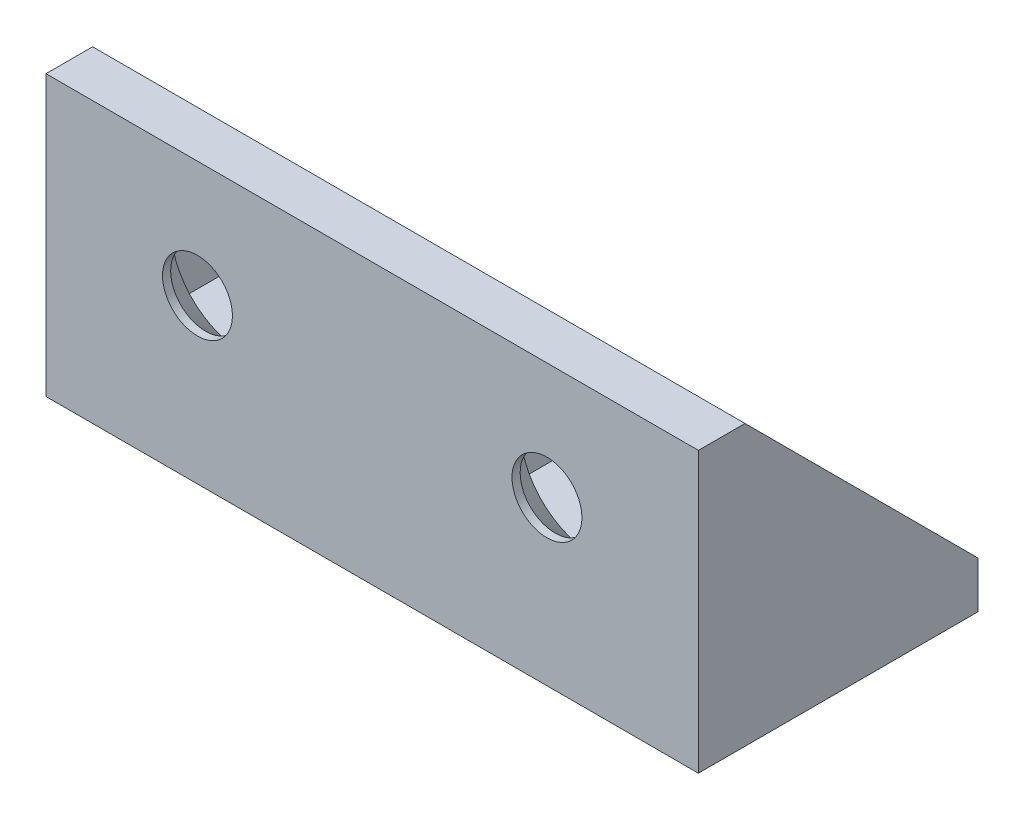
ISO-10303-21;
HEADER;
FILE_DESCRIPTION(('STEP AP214'),'2;1');
FILE_NAME('part.step','',(''),(''),'','','');
FILE_SCHEMA(('AUTOMOTIVE_DESIGN { 1 0 10303 214 1 1 1 1 }'));
ENDSEC;
DATA;
#1=APPLICATION_CONTEXT('core data for automotive mechanical design processes');
#2=APPLICATION_PROTOCOL_DEFINITION('international standard','automotive_design',2000,#1);
#3=PRODUCT_CONTEXT('',#1,'mechanical');
#4=PRODUCT('Part','Part','',(#3));
#5=PRODUCT_RELATED_PRODUCT_CATEGORY('part','',(#4));
#6=PRODUCT_DEFINITION_FORMATION('','',#4);
#7=PRODUCT_DEFINITION_CONTEXT('part definition',#1,'design');
#8=PRODUCT_DEFINITION('design','',#6,#7);
#9=PRODUCT_DEFINITION_SHAPE('','',#8);
#10=(LENGTH_UNIT() NAMED_UNIT(*) SI_UNIT(.MILLI.,.METRE.));
#11=(NAMED_UNIT(*) PLANE_ANGLE_UNIT() SI_UNIT($,.RADIAN.));
#12=(NAMED_UNIT(*) SI_UNIT($,.STERADIAN.) SOLID_ANGLE_UNIT());
#13=UNCERTAINTY_MEASURE_WITH_UNIT(LENGTH_MEASURE(1.E-05),#10,'distance_accuracy_value','');
#14=(GEOMETRIC_REPRESENTATION_CONTEXT(3) GLOBAL_UNCERTAINTY_ASSIGNED_CONTEXT((#13)) GLOBAL_UNIT_ASSIGNED_CONTEXT((#10,
#11,#12)) REPRESENTATION_CONTEXT('',''));
#15=CARTESIAN_POINT('',(0.,0.,0.));
#16=DIRECTION('',(0.,0.,1.));
#17=DIRECTION('',(1.,0.,0.));
#18=AXIS2_PLACEMENT_3D('',#15,#16,#17);
#19=CARTESIAN_POINT('',(9.99999999999999,14.,17.));
#20=DIRECTION('',(0.,0.,-1.));
#21=DIRECTION('',(-1.,0.,0.));
#22=AXIS2_PLACEMENT_3D('',#19,#20,#21);
#23=CYLINDRICAL_SURFACE('',#22,3.);
#24=CARTESIAN_POINT('',(9.99999999999999,14.,4.));
#25=DIRECTION('',(0.,0.,-1.));
#26=DIRECTION('',(-1.,0.,0.));
#27=AXIS2_PLACEMENT_3D('',#24,#25,#26);
#28=CIRCLE('',#27,3.);
#29=CARTESIAN_POINT('',(6.99999999999999,14.,4.));
#30=VERTEX_POINT('',#29);
#31=EDGE_CURVE('E200',#30,#30,#28,.T.);
#32=ORIENTED_EDGE('',*,*,#31,.F.);
#33=EDGE_LOOP('',(#32));
#34=FACE_BOUND('',#33,.T.);
#35=CARTESIAN_POINT('',(9.99999999999999,14.,3.3));
#36=DIRECTION('',(0.,0.,-1.));
#37=DIRECTION('',(-1.,0.,0.));
#38=AXIS2_PLACEMENT_3D('',#35,#36,#37);
#39=CIRCLE('',#38,3.);
#40=CARTESIAN_POINT('',(6.99999999999999,14.,3.3));
#41=VERTEX_POINT('',#40);
#42=EDGE_CURVE('E242',#41,#41,#39,.T.);
#43=ORIENTED_EDGE('',*,*,#42,.T.);
#44=EDGE_LOOP('',(#43));
#45=FACE_BOUND('',#44,.T.);
#46=ADVANCED_FACE('F37',(#34,#45),#23,.F.);
#47=CARTESIAN_POINT('',(40.,14.,17.));
#48=DIRECTION('',(0.,0.,-1.));
#49=DIRECTION('',(-1.,0.,0.));
#50=AXIS2_PLACEMENT_3D('',#47,#48,#49);
#51=CYLINDRICAL_SURFACE('',#50,3.);
#52=CARTESIAN_POINT('',(40.,14.,4.));
#53=DIRECTION('',(0.,0.,-1.));
#54=DIRECTION('',(-1.,0.,0.));
#55=AXIS2_PLACEMENT_3D('',#52,#53,#54);
#56=CIRCLE('',#55,3.);
#57=CARTESIAN_POINT('',(37.,14.,4.));
#58=VERTEX_POINT('',#57);
#59=EDGE_CURVE('E215',#58,#58,#56,.T.);
#60=ORIENTED_EDGE('',*,*,#59,.F.);
#61=EDGE_LOOP('',(#60));
#62=FACE_BOUND('',#61,.T.);
#63=CARTESIAN_POINT('',(40.,14.,3.30000000000001));
#64=DIRECTION('',(0.,0.,-1.));
#65=DIRECTION('',(-1.,0.,0.));
#66=AXIS2_PLACEMENT_3D('',#63,#64,#65);
#67=CIRCLE('',#66,3.);
#68=CARTESIAN_POINT('',(37.,14.,3.30000000000001));
#69=VERTEX_POINT('',#68);
#70=EDGE_CURVE('E236',#69,#69,#67,.T.);
#71=ORIENTED_EDGE('',*,*,#70,.T.);
#72=EDGE_LOOP('',(#71));
#73=FACE_BOUND('',#72,.T.);
#74=ADVANCED_FACE('F309',(#62,#73),#51,.F.);
#75=CARTESIAN_POINT('',(10.,-16.,-10.));
#76=DIRECTION('',(0.,1.,0.));
#77=DIRECTION('',(-1.,0.,0.));
#78=AXIS2_PLACEMENT_3D('',#75,#76,#77);
#79=CYLINDRICAL_SURFACE('',#78,2.5);
#80=CARTESIAN_POINT('',(10.,0.,-10.));
#81=DIRECTION('',(0.,1.,0.));
#82=DIRECTION('',(0.,0.,1.));
#83=AXIS2_PLACEMENT_3D('',#80,#81,#82);
#84=CIRCLE('',#83,2.5);
#85=CARTESIAN_POINT('',(10.,0.,-7.5));
#86=VERTEX_POINT('',#85);
#87=EDGE_CURVE('E218',#86,#86,#84,.T.);
#88=ORIENTED_EDGE('',*,*,#87,.F.);
#89=EDGE_LOOP('',(#88));
#90=FACE_BOUND('',#89,.T.);
#91=CARTESIAN_POINT('',(10.,0.699999999999994,-10.));
#92=DIRECTION('',(0.,1.,0.));
#93=DIRECTION('',(0.,0.,1.));
#94=AXIS2_PLACEMENT_3D('',#91,#92,#93);
#95=CIRCLE('',#94,2.5);
#96=CARTESIAN_POINT('',(10.,0.699999999999994,-7.5));
#97=VERTEX_POINT('',#96);
#98=EDGE_CURVE('E230',#97,#97,#95,.T.);
#99=ORIENTED_EDGE('',*,*,#98,.T.);
#100=EDGE_LOOP('',(#99));
#101=FACE_BOUND('',#100,.T.);
#102=ADVANCED_FACE('F315',(#90,#101),#79,.F.);
#103=CARTESIAN_POINT('',(53.,4.,-20.));
#104=DIRECTION('',(0.,0.707106781186548,-0.707106781186548));
#105=DIRECTION('',(0.,0.707106781186548,0.707106781186548));
#106=AXIS2_PLACEMENT_3D('',#103,#104,#105);
#107=PLANE('',#106);
#108=DIRECTION('',(0.,0.707106781186548,0.707106781186548));
#109=VECTOR('',#108,1.);
#110=CARTESIAN_POINT('',(27.5,4.,-20.));
#111=LINE('',#110,#109);
#112=CARTESIAN_POINT('',(27.5,4.,-20.));
#113=VERTEX_POINT('',#112);
#114=CARTESIAN_POINT('',(27.5,24.,0.));
#115=VERTEX_POINT('',#114);
#116=EDGE_CURVE('E11',#113,#115,#111,.T.);
#117=ORIENTED_EDGE('',*,*,#116,.F.);
#118=DIRECTION('',(-1.,0.,0.));
#119=VECTOR('',#118,1.);
#120=CARTESIAN_POINT('',(0.,4.,-20.));
#121=LINE('',#120,#119);
#122=CARTESIAN_POINT('',(22.5,4.,-20.));
#123=VERTEX_POINT('',#122);
#124=EDGE_CURVE('E279',#113,#123,#121,.T.);
#125=ORIENTED_EDGE('',*,*,#124,.T.);
#126=DIRECTION('',(0.,-0.707106781186548,-0.707106781186548));
#127=VECTOR('',#126,1.);
#128=CARTESIAN_POINT('',(22.5,4.,-20.));
#129=LINE('',#128,#127);
#130=CARTESIAN_POINT('',(22.5,24.,0.));
#131=VERTEX_POINT('',#130);
#132=EDGE_CURVE('E144',#131,#123,#129,.T.);
#133=ORIENTED_EDGE('',*,*,#132,.F.);
#134=DIRECTION('',(-1.,0.,0.));
#135=VECTOR('',#134,1.);
#136=CARTESIAN_POINT('',(0.,24.,0.));
#137=LINE('',#136,#135);
#138=EDGE_CURVE('E150',#115,#131,#137,.T.);
#139=ORIENTED_EDGE('',*,*,#138,.F.);
#140=EDGE_LOOP('',(#117,#125,#133,#139));
#141=FACE_BOUND('',#140,.T.);
#142=ADVANCED_FACE('F277',(#141),#107,.T.);
#143=DIRECTION('',(0.,-0.707106781186548,-0.707106781186548));
#144=VECTOR('',#143,1.);
#145=CARTESIAN_POINT('',(50.5,4.,-20.));
#146=LINE('',#145,#144);
#147=CARTESIAN_POINT('',(50.5,24.,0.));
#148=VERTEX_POINT('',#147);
#149=CARTESIAN_POINT('',(50.5,4.,-20.));
#150=VERTEX_POINT('',#149);
#151=EDGE_CURVE('E45',#148,#150,#146,.T.);
#152=ORIENTED_EDGE('',*,*,#151,.F.);
#153=CARTESIAN_POINT('',(53.,24.,0.));
#154=VERTEX_POINT('',#153);
#155=EDGE_CURVE('E141',#154,#148,#137,.T.);
#156=ORIENTED_EDGE('',*,*,#155,.F.);
#157=DIRECTION('',(0.,-0.707106781186548,-0.707106781186548));
#158=VECTOR('',#157,1.);
#159=CARTESIAN_POINT('',(53.,4.,-20.));
#160=LINE('',#159,#158);
#161=CARTESIAN_POINT('',(53.,4.,-20.));
#162=VERTEX_POINT('',#161);
#163=EDGE_CURVE('E173',#154,#162,#160,.T.);
#164=ORIENTED_EDGE('',*,*,#163,.T.);
#165=EDGE_CURVE('E143',#162,#150,#121,.T.);
#166=ORIENTED_EDGE('',*,*,#165,.T.);
#167=EDGE_LOOP('',(#152,#156,#164,#166));
#168=FACE_BOUND('',#167,.T.);
#169=ADVANCED_FACE('F139',(#168),#107,.T.);
#170=DIRECTION('',(0.,0.707106781186548,0.707106781186548));
#171=VECTOR('',#170,1.);
#172=CARTESIAN_POINT('',(-0.5,4.,-20.));
#173=LINE('',#172,#171);
#174=CARTESIAN_POINT('',(-0.5,4.,-20.));
#175=VERTEX_POINT('',#174);
#176=CARTESIAN_POINT('',(-0.5,24.,0.));
#177=VERTEX_POINT('',#176);
#178=EDGE_CURVE('E264',#175,#177,#173,.T.);
#179=ORIENTED_EDGE('',*,*,#178,.F.);
#180=CARTESIAN_POINT('',(-3.,4.,-20.));
#181=VERTEX_POINT('',#180);
#182=EDGE_CURVE('E282',#175,#181,#121,.T.);
#183=ORIENTED_EDGE('',*,*,#182,.T.);
#184=DIRECTION('',(0.,-0.707106781186548,-0.707106781186548));
#185=VECTOR('',#184,1.);
#186=CARTESIAN_POINT('',(-3.,4.,-20.));
#187=LINE('',#186,#185);
#188=CARTESIAN_POINT('',(-3.,24.,0.));
#189=VERTEX_POINT('',#188);
#190=EDGE_CURVE('E186',#189,#181,#187,.T.);
#191=ORIENTED_EDGE('',*,*,#190,.F.);
#192=EDGE_CURVE('E152',#177,#189,#137,.T.);
#193=ORIENTED_EDGE('',*,*,#192,.F.);
#194=EDGE_LOOP('',(#179,#183,#191,#193));
#195=FACE_BOUND('',#194,.T.);
#196=ADVANCED_FACE('F269',(#195),#107,.T.);
#197=CARTESIAN_POINT('',(53.,0.,0.));
#198=DIRECTION('',(1.,0.,0.));
#199=DIRECTION('',(0.,0.,-1.));
#200=AXIS2_PLACEMENT_3D('',#197,#198,#199);
#201=PLANE('',#200);
#202=ORIENTED_EDGE('',*,*,#163,.F.);
#203=DIRECTION('',(0.,0.,-1.));
#204=VECTOR('',#203,1.);
#205=CARTESIAN_POINT('',(53.,24.,0.));
#206=LINE('',#205,#204);
#207=CARTESIAN_POINT('',(53.,24.,4.));
#208=VERTEX_POINT('',#207);
#209=EDGE_CURVE('E148',#208,#154,#206,.T.);
#210=ORIENTED_EDGE('',*,*,#209,.F.);
#211=DIRECTION('',(0.,1.,0.));
#212=VECTOR('',#211,1.);
#213=CARTESIAN_POINT('',(53.,24.,4.));
#214=LINE('',#213,#212);
#215=CARTESIAN_POINT('',(53.,0.,4.));
#216=VERTEX_POINT('',#215);
#217=EDGE_CURVE('E163',#216,#208,#214,.T.);
#218=ORIENTED_EDGE('',*,*,#217,.F.);
#219=DIRECTION('',(0.,0.,1.));
#220=VECTOR('',#219,1.);
#221=CARTESIAN_POINT('',(53.,0.,-20.));
#222=LINE('',#221,#220);
#223=CARTESIAN_POINT('',(53.,0.,-20.));
#224=VERTEX_POINT('',#223);
#225=EDGE_CURVE('E167',#224,#216,#222,.T.);
#226=ORIENTED_EDGE('',*,*,#225,.F.);
#227=DIRECTION('',(0.,-1.,0.));
#228=VECTOR('',#227,1.);
#229=CARTESIAN_POINT('',(53.,4.,-20.));
#230=LINE('',#229,#228);
#231=EDGE_CURVE('E170',#162,#224,#230,.T.);
#232=ORIENTED_EDGE('',*,*,#231,.F.);
#233=EDGE_LOOP('',(#202,#210,#218,#226,#232));
#234=FACE_BOUND('',#233,.T.);
#235=ADVANCED_FACE('F294',(#234),#201,.T.);
#236=CARTESIAN_POINT('',(-3.,0.,0.));
#237=DIRECTION('',(1.,0.,0.));
#238=DIRECTION('',(0.,0.,-1.));
#239=AXIS2_PLACEMENT_3D('',#236,#237,#238);
#240=PLANE('',#239);
#241=ORIENTED_EDGE('',*,*,#190,.T.);
#242=DIRECTION('',(0.,-1.,0.));
#243=VECTOR('',#242,1.);
#244=CARTESIAN_POINT('',(-3.,4.,-20.));
#245=LINE('',#244,#243);
#246=CARTESIAN_POINT('',(-3.,0.,-20.));
#247=VERTEX_POINT('',#246);
#248=EDGE_CURVE('E183',#181,#247,#245,.T.);
#249=ORIENTED_EDGE('',*,*,#248,.T.);
#250=DIRECTION('',(0.,0.,1.));
#251=VECTOR('',#250,1.);
#252=CARTESIAN_POINT('',(-3.,0.,-20.));
#253=LINE('',#252,#251);
#254=CARTESIAN_POINT('',(-3.,0.,4.));
#255=VERTEX_POINT('',#254);
#256=EDGE_CURVE('E180',#247,#255,#253,.T.);
#257=ORIENTED_EDGE('',*,*,#256,.T.);
#258=DIRECTION('',(0.,1.,0.));
#259=VECTOR('',#258,1.);
#260=CARTESIAN_POINT('',(-3.,24.,4.));
#261=LINE('',#260,#259);
#262=CARTESIAN_POINT('',(-3.,24.,4.));
#263=VERTEX_POINT('',#262);
#264=EDGE_CURVE('E177',#255,#263,#261,.T.);
#265=ORIENTED_EDGE('',*,*,#264,.T.);
#266=DIRECTION('',(0.,0.,-1.));
#267=VECTOR('',#266,1.);
#268=CARTESIAN_POINT('',(-3.,24.,0.));
#269=LINE('',#268,#267);
#270=EDGE_CURVE('E175',#263,#189,#269,.T.);
#271=ORIENTED_EDGE('',*,*,#270,.T.);
#272=EDGE_LOOP('',(#241,#249,#257,#265,#271));
#273=FACE_BOUND('',#272,.T.);
#274=ADVANCED_FACE('F288',(#273),#240,.F.);
#275=CARTESIAN_POINT('',(0.,0.,0.));
#276=DIRECTION('',(0.,1.,0.));
#277=DIRECTION('',(0.,0.,1.));
#278=AXIS2_PLACEMENT_3D('',#275,#276,#277);
#279=PLANE('',#278);
#280=ORIENTED_EDGE('',*,*,#87,.T.);
#281=EDGE_LOOP('',(#280));
#282=FACE_BOUND('',#281,.T.);
#283=CARTESIAN_POINT('',(40.,0.,-10.));
#284=DIRECTION('',(0.,1.,0.));
#285=DIRECTION('',(0.,0.,1.));
#286=AXIS2_PLACEMENT_3D('',#283,#284,#285);
#287=CIRCLE('',#286,2.5);
#288=CARTESIAN_POINT('',(40.,0.,-7.5));
#289=VERTEX_POINT('',#288);
#290=EDGE_CURVE('E221',#289,#289,#287,.T.);
#291=ORIENTED_EDGE('',*,*,#290,.T.);
#292=EDGE_LOOP('',(#291));
#293=FACE_BOUND('',#292,.T.);
#294=DIRECTION('',(1.,0.,0.));
#295=VECTOR('',#294,1.);
#296=CARTESIAN_POINT('',(0.,0.,4.));
#297=LINE('',#296,#295);
#298=EDGE_CURVE('E149',#255,#216,#297,.T.);
#299=ORIENTED_EDGE('',*,*,#298,.F.);
#300=ORIENTED_EDGE('',*,*,#256,.F.);
#301=DIRECTION('',(-1.,0.,0.));
#302=VECTOR('',#301,1.);
#303=CARTESIAN_POINT('',(0.,0.,-20.));
#304=LINE('',#303,#302);
#305=EDGE_CURVE('E153',#224,#247,#304,.T.);
#306=ORIENTED_EDGE('',*,*,#305,.F.);
#307=ORIENTED_EDGE('',*,*,#225,.T.);
#308=EDGE_LOOP('',(#299,#300,#306,#307));
#309=FACE_BOUND('',#308,.T.);
#310=ADVANCED_FACE('F362',(#282,#293,#309),#279,.F.);
#311=CARTESIAN_POINT('',(0.,4.,4.));
#312=DIRECTION('',(0.,0.,-1.));
#313=DIRECTION('',(-1.,0.,0.));
#314=AXIS2_PLACEMENT_3D('',#311,#312,#313);
#315=PLANE('',#314);
#316=ORIENTED_EDGE('',*,*,#59,.T.);
#317=EDGE_LOOP('',(#316));
#318=FACE_BOUND('',#317,.T.);
#319=ORIENTED_EDGE('',*,*,#31,.T.);
#320=EDGE_LOOP('',(#319));
#321=FACE_BOUND('',#320,.T.);
#322=ORIENTED_EDGE('',*,*,#298,.T.);
#323=ORIENTED_EDGE('',*,*,#217,.T.);
#324=DIRECTION('',(1.,0.,0.));
#325=VECTOR('',#324,1.);
#326=CARTESIAN_POINT('',(0.,24.,4.));
#327=LINE('',#326,#325);
#328=EDGE_CURVE('E157',#263,#208,#327,.T.);
#329=ORIENTED_EDGE('',*,*,#328,.F.);
#330=ORIENTED_EDGE('',*,*,#264,.F.);
#331=EDGE_LOOP('',(#322,#323,#329,#330));
#332=FACE_BOUND('',#331,.T.);
#333=ADVANCED_FACE('F39',(#318,#321,#332),#315,.F.);
#334=CARTESIAN_POINT('',(0.,4.,-20.));
#335=DIRECTION('',(0.,0.,1.));
#336=DIRECTION('',(1.,0.,0.));
#337=AXIS2_PLACEMENT_3D('',#334,#335,#336);
#338=PLANE('',#337);
#339=ORIENTED_EDGE('',*,*,#305,.T.);
#340=ORIENTED_EDGE('',*,*,#248,.F.);
#341=ORIENTED_EDGE('',*,*,#182,.F.);
#342=DIRECTION('',(-1.,0.,0.));
#343=VECTOR('',#342,1.);
#344=CARTESIAN_POINT('',(22.5,4.,-20.));
#345=LINE('',#344,#343);
#346=EDGE_CURVE('E196',#123,#175,#345,.T.);
#347=ORIENTED_EDGE('',*,*,#346,.F.);
#348=ORIENTED_EDGE('',*,*,#124,.F.);
#349=DIRECTION('',(-1.,0.,0.));
#350=VECTOR('',#349,1.);
#351=CARTESIAN_POINT('',(50.5,4.,-20.));
#352=LINE('',#351,#350);
#353=EDGE_CURVE('E135',#150,#113,#352,.T.);
#354=ORIENTED_EDGE('',*,*,#353,.F.);
#355=ORIENTED_EDGE('',*,*,#165,.F.);
#356=ORIENTED_EDGE('',*,*,#231,.T.);
#357=EDGE_LOOP('',(#339,#340,#341,#347,#348,#354,#355,#356));
#358=FACE_BOUND('',#357,.T.);
#359=ADVANCED_FACE('F285',(#358),#338,.F.);
#360=CARTESIAN_POINT('',(0.,24.,0.));
#361=DIRECTION('',(0.,-1.,0.));
#362=DIRECTION('',(0.,0.,-1.));
#363=AXIS2_PLACEMENT_3D('',#360,#361,#362);
#364=PLANE('',#363);
#365=ORIENTED_EDGE('',*,*,#155,.T.);
#366=DIRECTION('',(1.,0.,0.));
#367=VECTOR('',#366,1.);
#368=CARTESIAN_POINT('',(50.5,24.,0.));
#369=LINE('',#368,#367);
#370=EDGE_CURVE('E128',#115,#148,#369,.T.);
#371=ORIENTED_EDGE('',*,*,#370,.F.);
#372=ORIENTED_EDGE('',*,*,#138,.T.);
#373=DIRECTION('',(1.,0.,0.));
#374=VECTOR('',#373,1.);
#375=CARTESIAN_POINT('',(22.5,24.,0.));
#376=LINE('',#375,#374);
#377=EDGE_CURVE('E203',#177,#131,#376,.T.);
#378=ORIENTED_EDGE('',*,*,#377,.F.);
#379=ORIENTED_EDGE('',*,*,#192,.T.);
#380=ORIENTED_EDGE('',*,*,#270,.F.);
#381=ORIENTED_EDGE('',*,*,#328,.T.);
#382=ORIENTED_EDGE('',*,*,#209,.T.);
#383=EDGE_LOOP('',(#365,#371,#372,#378,#379,#380,#381,#382));
#384=FACE_BOUND('',#383,.T.);
#385=ADVANCED_FACE('F146',(#384),#364,.F.);
#386=CARTESIAN_POINT('',(22.5,4.,0.));
#387=DIRECTION('',(0.,-1.,0.));
#388=DIRECTION('',(1.,0.,0.));
#389=AXIS2_PLACEMENT_3D('',#386,#387,#388);
#390=PLANE('',#389);
#391=CARTESIAN_POINT('',(10.,4.,-10.));
#392=DIRECTION('',(0.,1.,0.));
#393=DIRECTION('',(0.,0.,1.));
#394=AXIS2_PLACEMENT_3D('',#391,#392,#393);
#395=CIRCLE('',#394,5.79999999999997);
#396=CARTESIAN_POINT('',(10.,4.,-4.20000000000004));
#397=VERTEX_POINT('',#396);
#398=EDGE_CURVE('E233',#397,#397,#395,.T.);
#399=ORIENTED_EDGE('',*,*,#398,.F.);
#400=EDGE_LOOP('',(#399));
#401=FACE_BOUND('',#400,.T.);
#402=ORIENTED_EDGE('',*,*,#346,.T.);
#403=DIRECTION('',(0.,0.,-1.));
#404=VECTOR('',#403,1.);
#405=CARTESIAN_POINT('',(-0.5,4.,0.));
#406=LINE('',#405,#404);
#407=CARTESIAN_POINT('',(-0.5,4.,0.));
#408=VERTEX_POINT('',#407);
#409=EDGE_CURVE('E190',#408,#175,#406,.T.);
#410=ORIENTED_EDGE('',*,*,#409,.F.);
#411=DIRECTION('',(-1.,0.,0.));
#412=VECTOR('',#411,1.);
#413=CARTESIAN_POINT('',(22.5,4.,0.));
#414=LINE('',#413,#412);
#415=CARTESIAN_POINT('',(22.5,4.,0.));
#416=VERTEX_POINT('',#415);
#417=EDGE_CURVE('E199',#416,#408,#414,.T.);
#418=ORIENTED_EDGE('',*,*,#417,.F.);
#419=DIRECTION('',(0.,0.,-1.));
#420=VECTOR('',#419,1.);
#421=CARTESIAN_POINT('',(22.5,4.,0.));
#422=LINE('',#421,#420);
#423=EDGE_CURVE('E192',#416,#123,#422,.T.);
#424=ORIENTED_EDGE('',*,*,#423,.T.);
#425=EDGE_LOOP('',(#402,#410,#418,#424));
#426=FACE_BOUND('',#425,.T.);
#427=ADVANCED_FACE('F260',(#401,#426),#390,.F.);
#428=CARTESIAN_POINT('',(22.5,24.,0.));
#429=DIRECTION('',(1.,0.,0.));
#430=DIRECTION('',(0.,0.,-1.));
#431=AXIS2_PLACEMENT_3D('',#428,#429,#430);
#432=PLANE('',#431);
#433=ORIENTED_EDGE('',*,*,#132,.T.);
#434=ORIENTED_EDGE('',*,*,#423,.F.);
#435=DIRECTION('',(0.,-1.,0.));
#436=VECTOR('',#435,1.);
#437=CARTESIAN_POINT('',(22.5,24.,0.));
#438=LINE('',#437,#436);
#439=EDGE_CURVE('E193',#131,#416,#438,.T.);
#440=ORIENTED_EDGE('',*,*,#439,.F.);
#441=EDGE_LOOP('',(#433,#434,#440));
#442=FACE_BOUND('',#441,.T.);
#443=ADVANCED_FACE('F273',(#442),#432,.F.);
#444=CARTESIAN_POINT('',(-0.5,4.,0.));
#445=DIRECTION('',(-1.,0.,0.));
#446=DIRECTION('',(0.,0.,1.));
#447=AXIS2_PLACEMENT_3D('',#444,#445,#446);
#448=PLANE('',#447);
#449=ORIENTED_EDGE('',*,*,#178,.T.);
#450=DIRECTION('',(0.,1.,0.));
#451=VECTOR('',#450,1.);
#452=CARTESIAN_POINT('',(-0.5,4.,0.));
#453=LINE('',#452,#451);
#454=EDGE_CURVE('E52',#408,#177,#453,.T.);
#455=ORIENTED_EDGE('',*,*,#454,.F.);
#456=ORIENTED_EDGE('',*,*,#409,.T.);
#457=EDGE_LOOP('',(#449,#455,#456));
#458=FACE_BOUND('',#457,.T.);
#459=ADVANCED_FACE('F255',(#458),#448,.F.);
#460=CARTESIAN_POINT('',(0.,0.,0.));
#461=DIRECTION('',(0.,0.,-1.));
#462=DIRECTION('',(-1.,0.,0.));
#463=AXIS2_PLACEMENT_3D('',#460,#461,#462);
#464=PLANE('',#463);
#465=CARTESIAN_POINT('',(9.99999999999999,14.,0.));
#466=DIRECTION('',(0.,0.,-1.));
#467=DIRECTION('',(-1.,0.,0.));
#468=AXIS2_PLACEMENT_3D('',#465,#466,#467);
#469=CIRCLE('',#468,6.29999999999997);
#470=CARTESIAN_POINT('',(3.70000000000003,14.,0.));
#471=VERTEX_POINT('',#470);
#472=EDGE_CURVE('E245',#471,#471,#469,.T.);
#473=ORIENTED_EDGE('',*,*,#472,.F.);
#474=EDGE_LOOP('',(#473));
#475=FACE_BOUND('',#474,.T.);
#476=ORIENTED_EDGE('',*,*,#417,.T.);
#477=ORIENTED_EDGE('',*,*,#454,.T.);
#478=ORIENTED_EDGE('',*,*,#377,.T.);
#479=ORIENTED_EDGE('',*,*,#439,.T.);
#480=EDGE_LOOP('',(#476,#477,#478,#479));
#481=FACE_BOUND('',#480,.T.);
#482=ADVANCED_FACE('F252',(#475,#481),#464,.T.);
#483=CARTESIAN_POINT('',(27.5,4.,0.));
#484=DIRECTION('',(-1.,0.,0.));
#485=DIRECTION('',(0.,0.,1.));
#486=AXIS2_PLACEMENT_3D('',#483,#484,#485);
#487=PLANE('',#486);
#488=ORIENTED_EDGE('',*,*,#116,.T.);
#489=DIRECTION('',(0.,1.,0.));
#490=VECTOR('',#489,1.);
#491=CARTESIAN_POINT('',(27.5,4.,0.));
#492=LINE('',#491,#490);
#493=CARTESIAN_POINT('',(27.5,4.,0.));
#494=VERTEX_POINT('',#493);
#495=EDGE_CURVE('E60',#494,#115,#492,.T.);
#496=ORIENTED_EDGE('',*,*,#495,.F.);
#497=DIRECTION('',(0.,0.,-1.));
#498=VECTOR('',#497,1.);
#499=CARTESIAN_POINT('',(27.5,4.,0.));
#500=LINE('',#499,#498);
#501=EDGE_CURVE('E189',#494,#113,#500,.T.);
#502=ORIENTED_EDGE('',*,*,#501,.T.);
#503=EDGE_LOOP('',(#488,#496,#502));
#504=FACE_BOUND('',#503,.T.);
#505=ADVANCED_FACE('F254',(#504),#487,.F.);
#506=CARTESIAN_POINT('',(50.5,4.,0.));
#507=DIRECTION('',(0.,-1.,0.));
#508=DIRECTION('',(1.,0.,0.));
#509=AXIS2_PLACEMENT_3D('',#506,#507,#508);
#510=PLANE('',#509);
#511=CARTESIAN_POINT('',(40.,4.,-10.));
#512=DIRECTION('',(0.,-1.,0.));
#513=DIRECTION('',(0.,0.,-1.));
#514=AXIS2_PLACEMENT_3D('',#511,#512,#513);
#515=CIRCLE('',#514,5.79999999999999);
#516=CARTESIAN_POINT('',(40.,4.,-15.8));
#517=VERTEX_POINT('',#516);
#518=EDGE_CURVE('E224',#517,#517,#515,.T.);
#519=ORIENTED_EDGE('',*,*,#518,.T.);
#520=EDGE_LOOP('',(#519));
#521=FACE_BOUND('',#520,.T.);
#522=ORIENTED_EDGE('',*,*,#353,.T.);
#523=ORIENTED_EDGE('',*,*,#501,.F.);
#524=DIRECTION('',(-1.,0.,0.));
#525=VECTOR('',#524,1.);
#526=CARTESIAN_POINT('',(50.5,4.,0.));
#527=LINE('',#526,#525);
#528=CARTESIAN_POINT('',(50.5,4.,0.));
#529=VERTEX_POINT('',#528);
#530=EDGE_CURVE('E127',#529,#494,#527,.T.);
#531=ORIENTED_EDGE('',*,*,#530,.F.);
#532=DIRECTION('',(0.,0.,-1.));
#533=VECTOR('',#532,1.);
#534=CARTESIAN_POINT('',(50.5,4.,0.));
#535=LINE('',#534,#533);
#536=EDGE_CURVE('E125',#529,#150,#535,.T.);
#537=ORIENTED_EDGE('',*,*,#536,.T.);
#538=EDGE_LOOP('',(#522,#523,#531,#537));
#539=FACE_BOUND('',#538,.T.);
#540=ADVANCED_FACE('F298',(#521,#539),#510,.F.);
#541=CARTESIAN_POINT('',(50.5,24.,0.));
#542=DIRECTION('',(1.,0.,0.));
#543=DIRECTION('',(0.,0.,-1.));
#544=AXIS2_PLACEMENT_3D('',#541,#542,#543);
#545=PLANE('',#544);
#546=ORIENTED_EDGE('',*,*,#151,.T.);
#547=ORIENTED_EDGE('',*,*,#536,.F.);
#548=DIRECTION('',(0.,-1.,0.));
#549=VECTOR('',#548,1.);
#550=CARTESIAN_POINT('',(50.5,24.,0.));
#551=LINE('',#550,#549);
#552=EDGE_CURVE('E121',#148,#529,#551,.T.);
#553=ORIENTED_EDGE('',*,*,#552,.F.);
#554=EDGE_LOOP('',(#546,#547,#553));
#555=FACE_BOUND('',#554,.T.);
#556=ADVANCED_FACE('F122',(#555),#545,.F.);
#557=CARTESIAN_POINT('',(0.,0.,0.));
#558=DIRECTION('',(0.,0.,-1.));
#559=DIRECTION('',(-1.,0.,0.));
#560=AXIS2_PLACEMENT_3D('',#557,#558,#559);
#561=PLANE('',#560);
#562=CARTESIAN_POINT('',(40.,14.,0.));
#563=DIRECTION('',(0.,0.,-1.));
#564=DIRECTION('',(-1.,0.,0.));
#565=AXIS2_PLACEMENT_3D('',#562,#563,#564);
#566=CIRCLE('',#565,6.29999999999997);
#567=CARTESIAN_POINT('',(33.7,14.,0.));
#568=VERTEX_POINT('',#567);
#569=EDGE_CURVE('E239',#568,#568,#566,.T.);
#570=ORIENTED_EDGE('',*,*,#569,.F.);
#571=EDGE_LOOP('',(#570));
#572=FACE_BOUND('',#571,.T.);
#573=ORIENTED_EDGE('',*,*,#370,.T.);
#574=ORIENTED_EDGE('',*,*,#552,.T.);
#575=ORIENTED_EDGE('',*,*,#530,.T.);
#576=ORIENTED_EDGE('',*,*,#495,.T.);
#577=EDGE_LOOP('',(#573,#574,#575,#576));
#578=FACE_BOUND('',#577,.T.);
#579=ADVANCED_FACE('F131',(#572,#578),#561,.T.);
#580=CARTESIAN_POINT('',(40.,-16.,-10.));
#581=DIRECTION('',(0.,1.,0.));
#582=DIRECTION('',(-1.,0.,0.));
#583=AXIS2_PLACEMENT_3D('',#580,#581,#582);
#584=CYLINDRICAL_SURFACE('',#583,2.5);
#585=CARTESIAN_POINT('',(40.,0.7,-10.));
#586=DIRECTION('',(0.,-1.,0.));
#587=DIRECTION('',(0.,0.,-1.));
#588=AXIS2_PLACEMENT_3D('',#585,#586,#587);
#589=CIRCLE('',#588,2.5);
#590=CARTESIAN_POINT('',(40.,0.7,-12.5));
#591=VERTEX_POINT('',#590);
#592=EDGE_CURVE('E227',#591,#591,#589,.T.);
#593=ORIENTED_EDGE('',*,*,#592,.F.);
#594=EDGE_LOOP('',(#593));
#595=FACE_BOUND('',#594,.T.);
#596=ORIENTED_EDGE('',*,*,#290,.F.);
#597=EDGE_LOOP('',(#596));
#598=FACE_BOUND('',#597,.T.);
#599=ADVANCED_FACE('F322',(#595,#598),#584,.F.);
#600=CARTESIAN_POINT('',(40.,4.,-10.));
#601=DIRECTION('',(0.,1.,0.));
#602=DIRECTION('',(0.,0.,1.));
#603=AXIS2_PLACEMENT_3D('',#600,#601,#602);
#604=CONICAL_SURFACE('',#603,5.79999999999999,0.785398163397447);
#605=ORIENTED_EDGE('',*,*,#592,.T.);
#606=EDGE_LOOP('',(#605));
#607=FACE_BOUND('',#606,.T.);
#608=ORIENTED_EDGE('',*,*,#518,.F.);
#609=EDGE_LOOP('',(#608));
#610=FACE_BOUND('',#609,.T.);
#611=ADVANCED_FACE('F328',(#607,#610),#604,.F.);
#612=CARTESIAN_POINT('',(10.,0.699999999999994,-10.));
#613=DIRECTION('',(0.,1.,0.));
#614=DIRECTION('',(0.,0.,1.));
#615=AXIS2_PLACEMENT_3D('',#612,#613,#614);
#616=CONICAL_SURFACE('',#615,2.5,0.785398163397442);
#617=ORIENTED_EDGE('',*,*,#398,.T.);
#618=EDGE_LOOP('',(#617));
#619=FACE_BOUND('',#618,.T.);
#620=ORIENTED_EDGE('',*,*,#98,.F.);
#621=EDGE_LOOP('',(#620));
#622=FACE_BOUND('',#621,.T.);
#623=ADVANCED_FACE('F336',(#619,#622),#616,.F.);
#624=CARTESIAN_POINT('',(40.,14.,3.30000000000001));
#625=DIRECTION('',(0.,0.,-1.));
#626=DIRECTION('',(-1.,0.,0.));
#627=AXIS2_PLACEMENT_3D('',#624,#625,#626);
#628=CONICAL_SURFACE('',#627,3.,0.785398163397445);
#629=ORIENTED_EDGE('',*,*,#569,.T.);
#630=EDGE_LOOP('',(#629));
#631=FACE_BOUND('',#630,.T.);
#632=ORIENTED_EDGE('',*,*,#70,.F.);
#633=EDGE_LOOP('',(#632));
#634=FACE_BOUND('',#633,.T.);
#635=ADVANCED_FACE('F333',(#631,#634),#628,.F.);
#636=CARTESIAN_POINT('',(9.99999999999999,14.,3.3));
#637=DIRECTION('',(0.,0.,-1.));
#638=DIRECTION('',(-1.,0.,0.));
#639=AXIS2_PLACEMENT_3D('',#636,#637,#638);
#640=CONICAL_SURFACE('',#639,3.,0.785398163397443);
#641=ORIENTED_EDGE('',*,*,#472,.T.);
#642=EDGE_LOOP('',(#641));
#643=FACE_BOUND('',#642,.T.);
#644=ORIENTED_EDGE('',*,*,#42,.F.);
#645=EDGE_LOOP('',(#644));
#646=FACE_BOUND('',#645,.T.);
#647=ADVANCED_FACE('F249',(#643,#646),#640,.F.);
#648=CLOSED_SHELL('',(#46,#74,#102,#142,#169,#196,#235,#274,#310,#333,#359,#385,#427,#443,#459,
#482,#505,#540,#556,#579,#599,#611,#623,#635,#647));
#649=MANIFOLD_SOLID_BREP('B2',#648);
#650=ADVANCED_BREP_SHAPE_REPRESENTATION('',(#18,#649),#14);
#651=SHAPE_DEFINITION_REPRESENTATION(#9,#650);
ENDSEC;
END-ISO-10303-21;
